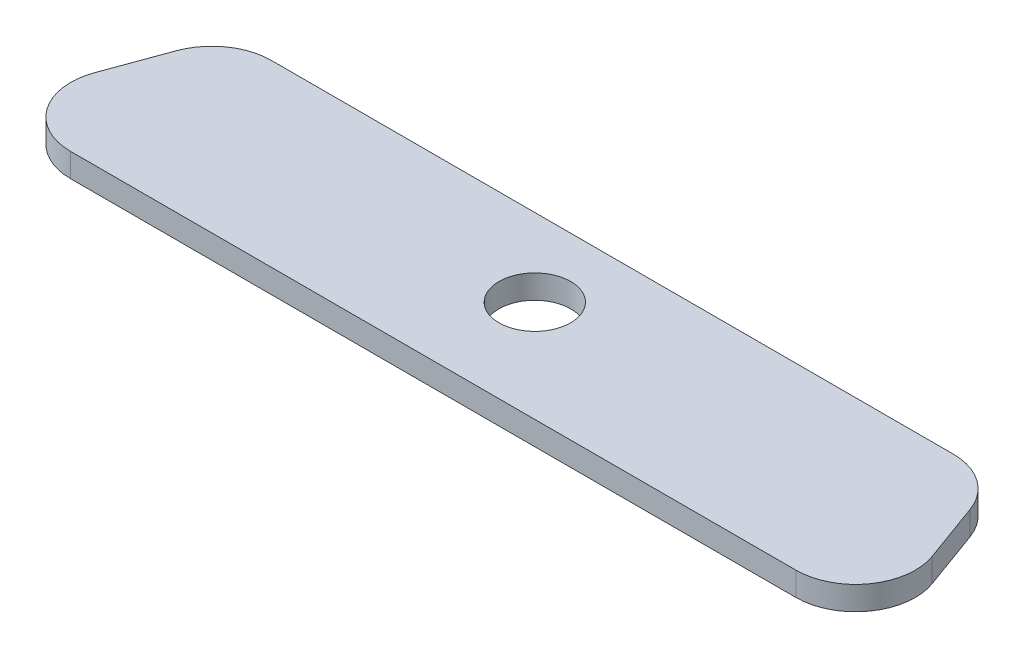
ISO-10303-21;
HEADER;
FILE_DESCRIPTION(('STEP AP214'),'2;1');
FILE_NAME('part.step','',(''),(''),'','','');
FILE_SCHEMA(('AUTOMOTIVE_DESIGN { 1 0 10303 214 1 1 1 1 }'));
ENDSEC;
DATA;
#1=APPLICATION_CONTEXT('core data for automotive mechanical design processes');
#2=APPLICATION_PROTOCOL_DEFINITION('international standard','automotive_design',2000,#1);
#3=PRODUCT_CONTEXT('',#1,'mechanical');
#4=PRODUCT('Part','Part','',(#3));
#5=PRODUCT_RELATED_PRODUCT_CATEGORY('part','',(#4));
#6=PRODUCT_DEFINITION_FORMATION('','',#4);
#7=PRODUCT_DEFINITION_CONTEXT('part definition',#1,'design');
#8=PRODUCT_DEFINITION('design','',#6,#7);
#9=PRODUCT_DEFINITION_SHAPE('','',#8);
#10=(LENGTH_UNIT() NAMED_UNIT(*) SI_UNIT(.MILLI.,.METRE.));
#11=(NAMED_UNIT(*) PLANE_ANGLE_UNIT() SI_UNIT($,.RADIAN.));
#12=(NAMED_UNIT(*) SI_UNIT($,.STERADIAN.) SOLID_ANGLE_UNIT());
#13=UNCERTAINTY_MEASURE_WITH_UNIT(LENGTH_MEASURE(1.E-05),#10,'distance_accuracy_value','');
#14=(GEOMETRIC_REPRESENTATION_CONTEXT(3) GLOBAL_UNCERTAINTY_ASSIGNED_CONTEXT((#13)) GLOBAL_UNIT_ASSIGNED_CONTEXT((#10,
#11,#12)) REPRESENTATION_CONTEXT('',''));
#15=CARTESIAN_POINT('',(0.,0.,0.));
#16=DIRECTION('',(0.,0.,1.));
#17=DIRECTION('',(1.,0.,0.));
#18=AXIS2_PLACEMENT_3D('',#15,#16,#17);
#19=CARTESIAN_POINT('',(0.,0.79375,0.));
#20=DIRECTION('',(0.,1.,0.));
#21=DIRECTION('',(0.,0.,1.));
#22=AXIS2_PLACEMENT_3D('',#19,#20,#21);
#23=PLANE('',#22);
#24=DIRECTION('',(-1.,0.,0.));
#25=VECTOR('',#24,1.);
#26=CARTESIAN_POINT('',(27.8161785944028,0.79375,-6.00000000000001));
#27=LINE('',#26,#25);
#28=CARTESIAN_POINT('',(26.4157635179833,0.79375,-6.00000000000001));
#29=VERTEX_POINT('',#28);
#30=CARTESIAN_POINT('',(3.58423648201666,0.79375,-6.));
#31=VERTEX_POINT('',#30);
#32=EDGE_CURVE('E149',#29,#31,#27,.T.);
#33=ORIENTED_EDGE('',*,*,#32,.T.);
#34=CARTESIAN_POINT('',(3.58423648201666,0.79375,-4.));
#35=DIRECTION('',(0.,1.,0.));
#36=DIRECTION('',(0.,0.,1.));
#37=AXIS2_PLACEMENT_3D('',#34,#35,#36);
#38=CIRCLE('',#37,2.);
#39=CARTESIAN_POINT('',(1.70485124044484,0.79375,-4.68404028665135));
#40=VERTEX_POINT('',#39);
#41=EDGE_CURVE('E179',#31,#40,#38,.T.);
#42=ORIENTED_EDGE('',*,*,#41,.T.);
#43=DIRECTION('',(-0.342020143325672,0.,0.939692620785907));
#44=VECTOR('',#43,1.);
#45=CARTESIAN_POINT('',(2.18382140559724,0.79375,-6.));
#46=LINE('',#45,#44);
#47=CARTESIAN_POINT('',(0.976910771912427,0.79375,-2.68404028665135));
#48=VERTEX_POINT('',#47);
#49=EDGE_CURVE('E128',#40,#48,#46,.T.);
#50=ORIENTED_EDGE('',*,*,#49,.T.);
#51=CARTESIAN_POINT('',(2.85629601348424,0.79375,-2.));
#52=DIRECTION('',(0.,1.,0.));
#53=DIRECTION('',(0.,0.,1.));
#54=AXIS2_PLACEMENT_3D('',#51,#52,#53);
#55=CIRCLE('',#54,2.);
#56=CARTESIAN_POINT('',(2.85629601348424,0.79375,0.));
#57=VERTEX_POINT('',#56);
#58=EDGE_CURVE('E176',#48,#57,#55,.T.);
#59=ORIENTED_EDGE('',*,*,#58,.T.);
#60=DIRECTION('',(1.,0.,0.));
#61=VECTOR('',#60,1.);
#62=CARTESIAN_POINT('',(0.,0.79375,0.));
#63=LINE('',#62,#61);
#64=CARTESIAN_POINT('',(27.1437039865158,0.79375,0.));
#65=VERTEX_POINT('',#64);
#66=EDGE_CURVE('E205',#57,#65,#63,.T.);
#67=ORIENTED_EDGE('',*,*,#66,.T.);
#68=CARTESIAN_POINT('',(27.1437039865158,0.79375,-2.00000000000001));
#69=DIRECTION('',(0.,1.,0.));
#70=DIRECTION('',(0.,0.,1.));
#71=AXIS2_PLACEMENT_3D('',#68,#69,#70);
#72=CIRCLE('',#71,2.);
#73=CARTESIAN_POINT('',(29.0230892280876,0.79375,-2.68404028665135));
#74=VERTEX_POINT('',#73);
#75=EDGE_CURVE('E62',#65,#74,#72,.T.);
#76=ORIENTED_EDGE('',*,*,#75,.T.);
#77=DIRECTION('',(-0.342020143325673,0.,-0.939692620785907));
#78=VECTOR('',#77,1.);
#79=CARTESIAN_POINT('',(30.,0.79375,0.));
#80=LINE('',#79,#78);
#81=CARTESIAN_POINT('',(28.2951487595552,0.79375,-4.68404028665135));
#82=VERTEX_POINT('',#81);
#83=EDGE_CURVE('E193',#74,#82,#80,.T.);
#84=ORIENTED_EDGE('',*,*,#83,.T.);
#85=CARTESIAN_POINT('',(26.4157635179833,0.79375,-4.00000000000001));
#86=DIRECTION('',(0.,1.,0.));
#87=DIRECTION('',(0.,0.,1.));
#88=AXIS2_PLACEMENT_3D('',#85,#86,#87);
#89=CIRCLE('',#88,2.);
#90=EDGE_CURVE('E173',#82,#29,#89,.T.);
#91=ORIENTED_EDGE('',*,*,#90,.T.);
#92=EDGE_LOOP('',(#33,#42,#50,#59,#67,#76,#84,#91));
#93=FACE_BOUND('',#92,.T.);
#94=CARTESIAN_POINT('',(15.,0.79375,-3.40000000000001));
#95=DIRECTION('',(0.,1.,0.));
#96=DIRECTION('',(0.,0.,1.));
#97=AXIS2_PLACEMENT_3D('',#94,#95,#96);
#98=CIRCLE('',#97,1.2);
#99=CARTESIAN_POINT('',(15.,0.79375,-2.2));
#100=VERTEX_POINT('',#99);
#101=EDGE_CURVE('E138',#100,#100,#98,.T.);
#102=ORIENTED_EDGE('',*,*,#101,.F.);
#103=EDGE_LOOP('',(#102));
#104=FACE_BOUND('',#103,.T.);
#105=ADVANCED_FACE('F41',(#93,#104),#23,.T.);
#106=CARTESIAN_POINT('',(0.,0.,0.));
#107=DIRECTION('',(0.,1.,0.));
#108=DIRECTION('',(0.,0.,1.));
#109=AXIS2_PLACEMENT_3D('',#106,#107,#108);
#110=PLANE('',#109);
#111=DIRECTION('',(-0.342020143325672,0.,0.939692620785907));
#112=VECTOR('',#111,1.);
#113=CARTESIAN_POINT('',(2.18382140559724,0.,-6.));
#114=LINE('',#113,#112);
#115=CARTESIAN_POINT('',(1.70485124044484,0.,-4.68404028665135));
#116=VERTEX_POINT('',#115);
#117=CARTESIAN_POINT('',(0.976910771912427,0.,-2.68404028665135));
#118=VERTEX_POINT('',#117);
#119=EDGE_CURVE('E125',#116,#118,#114,.T.);
#120=ORIENTED_EDGE('',*,*,#119,.F.);
#121=CARTESIAN_POINT('',(3.58423648201666,0.,-4.));
#122=DIRECTION('',(0.,1.,0.));
#123=DIRECTION('',(0.,0.,1.));
#124=AXIS2_PLACEMENT_3D('',#121,#122,#123);
#125=CIRCLE('',#124,2.);
#126=CARTESIAN_POINT('',(3.58423648201666,0.,-6.));
#127=VERTEX_POINT('',#126);
#128=EDGE_CURVE('E107',#116,#127,#125,.F.);
#129=ORIENTED_EDGE('',*,*,#128,.T.);
#130=DIRECTION('',(-1.,0.,0.));
#131=VECTOR('',#130,1.);
#132=CARTESIAN_POINT('',(27.8161785944028,0.,-6.00000000000001));
#133=LINE('',#132,#131);
#134=CARTESIAN_POINT('',(26.4157635179833,0.,-6.00000000000001));
#135=VERTEX_POINT('',#134);
#136=EDGE_CURVE('E154',#135,#127,#133,.T.);
#137=ORIENTED_EDGE('',*,*,#136,.F.);
#138=CARTESIAN_POINT('',(26.4157635179833,0.,-4.00000000000001));
#139=DIRECTION('',(0.,1.,0.));
#140=DIRECTION('',(0.,0.,1.));
#141=AXIS2_PLACEMENT_3D('',#138,#139,#140);
#142=CIRCLE('',#141,2.);
#143=CARTESIAN_POINT('',(28.2951487595552,0.,-4.68404028665135));
#144=VERTEX_POINT('',#143);
#145=EDGE_CURVE('E161',#135,#144,#142,.F.);
#146=ORIENTED_EDGE('',*,*,#145,.T.);
#147=DIRECTION('',(-0.342020143325673,0.,-0.939692620785907));
#148=VECTOR('',#147,1.);
#149=CARTESIAN_POINT('',(30.,0.,0.));
#150=LINE('',#149,#148);
#151=CARTESIAN_POINT('',(29.0230892280876,0.,-2.68404028665135));
#152=VERTEX_POINT('',#151);
#153=EDGE_CURVE('E143',#152,#144,#150,.T.);
#154=ORIENTED_EDGE('',*,*,#153,.F.);
#155=CARTESIAN_POINT('',(27.1437039865158,0.,-2.00000000000001));
#156=DIRECTION('',(0.,1.,0.));
#157=DIRECTION('',(0.,0.,1.));
#158=AXIS2_PLACEMENT_3D('',#155,#156,#157);
#159=CIRCLE('',#158,2.);
#160=CARTESIAN_POINT('',(27.1437039865158,0.,0.));
#161=VERTEX_POINT('',#160);
#162=EDGE_CURVE('E130',#152,#161,#159,.F.);
#163=ORIENTED_EDGE('',*,*,#162,.T.);
#164=DIRECTION('',(1.,0.,0.));
#165=VECTOR('',#164,1.);
#166=CARTESIAN_POINT('',(0.,0.,0.));
#167=LINE('',#166,#165);
#168=CARTESIAN_POINT('',(2.85629601348424,0.,0.));
#169=VERTEX_POINT('',#168);
#170=EDGE_CURVE('E137',#169,#161,#167,.T.);
#171=ORIENTED_EDGE('',*,*,#170,.F.);
#172=CARTESIAN_POINT('',(2.85629601348424,0.,-2.));
#173=DIRECTION('',(0.,1.,0.));
#174=DIRECTION('',(0.,0.,1.));
#175=AXIS2_PLACEMENT_3D('',#172,#173,#174);
#176=CIRCLE('',#175,2.);
#177=EDGE_CURVE('E119',#169,#118,#176,.F.);
#178=ORIENTED_EDGE('',*,*,#177,.T.);
#179=EDGE_LOOP('',(#120,#129,#137,#146,#154,#163,#171,#178));
#180=FACE_BOUND('',#179,.T.);
#181=CARTESIAN_POINT('',(15.,0.,-3.40000000000001));
#182=DIRECTION('',(0.,1.,0.));
#183=DIRECTION('',(0.,0.,1.));
#184=AXIS2_PLACEMENT_3D('',#181,#182,#183);
#185=CIRCLE('',#184,1.2);
#186=CARTESIAN_POINT('',(15.,0.,-2.2));
#187=VERTEX_POINT('',#186);
#188=EDGE_CURVE('E146',#187,#187,#185,.T.);
#189=ORIENTED_EDGE('',*,*,#188,.T.);
#190=EDGE_LOOP('',(#189));
#191=FACE_BOUND('',#190,.T.);
#192=ADVANCED_FACE('F133',(#180,#191),#110,.F.);
#193=CARTESIAN_POINT('',(2.18382140559724,0.79375,-6.));
#194=DIRECTION('',(0.939692620785907,0.,0.342020143325672));
#195=DIRECTION('',(0.342020143325672,0.,-0.939692620785907));
#196=AXIS2_PLACEMENT_3D('',#193,#194,#195);
#197=PLANE('',#196);
#198=ORIENTED_EDGE('',*,*,#49,.F.);
#199=DIRECTION('',(0.,-1.,0.));
#200=VECTOR('',#199,1.);
#201=CARTESIAN_POINT('',(1.70485124044484,0.79375,-4.68404028665135));
#202=LINE('',#201,#200);
#203=EDGE_CURVE('E111',#40,#116,#202,.T.);
#204=ORIENTED_EDGE('',*,*,#203,.T.);
#205=ORIENTED_EDGE('',*,*,#119,.T.);
#206=DIRECTION('',(0.,-1.,0.));
#207=VECTOR('',#206,1.);
#208=CARTESIAN_POINT('',(0.976910771912427,0.79375,-2.68404028665135));
#209=LINE('',#208,#207);
#210=EDGE_CURVE('E131',#118,#48,#209,.F.);
#211=ORIENTED_EDGE('',*,*,#210,.T.);
#212=EDGE_LOOP('',(#198,#204,#205,#211));
#213=FACE_BOUND('',#212,.T.);
#214=ADVANCED_FACE('F124',(#213),#197,.F.);
#215=CARTESIAN_POINT('',(0.,0.79375,0.));
#216=DIRECTION('',(0.,0.,-1.));
#217=DIRECTION('',(-1.,0.,0.));
#218=AXIS2_PLACEMENT_3D('',#215,#216,#217);
#219=PLANE('',#218);
#220=ORIENTED_EDGE('',*,*,#66,.F.);
#221=DIRECTION('',(0.,-1.,0.));
#222=VECTOR('',#221,1.);
#223=CARTESIAN_POINT('',(2.85629601348424,0.79375,0.));
#224=LINE('',#223,#222);
#225=EDGE_CURVE('E185',#57,#169,#224,.T.);
#226=ORIENTED_EDGE('',*,*,#225,.T.);
#227=ORIENTED_EDGE('',*,*,#170,.T.);
#228=DIRECTION('',(0.,-1.,0.));
#229=VECTOR('',#228,1.);
#230=CARTESIAN_POINT('',(27.1437039865158,0.79375,0.));
#231=LINE('',#230,#229);
#232=EDGE_CURVE('E182',#161,#65,#231,.F.);
#233=ORIENTED_EDGE('',*,*,#232,.T.);
#234=EDGE_LOOP('',(#220,#226,#227,#233));
#235=FACE_BOUND('',#234,.T.);
#236=ADVANCED_FACE('F236',(#235),#219,.F.);
#237=CARTESIAN_POINT('',(30.,0.79375,0.));
#238=DIRECTION('',(-0.939692620785907,0.,0.342020143325673));
#239=DIRECTION('',(0.342020143325673,0.,0.939692620785907));
#240=AXIS2_PLACEMENT_3D('',#237,#238,#239);
#241=PLANE('',#240);
#242=ORIENTED_EDGE('',*,*,#153,.T.);
#243=DIRECTION('',(0.,-1.,0.));
#244=VECTOR('',#243,1.);
#245=CARTESIAN_POINT('',(28.2951487595552,0.79375,-4.68404028665135));
#246=LINE('',#245,#244);
#247=EDGE_CURVE('E11',#144,#82,#246,.F.);
#248=ORIENTED_EDGE('',*,*,#247,.T.);
#249=ORIENTED_EDGE('',*,*,#83,.F.);
#250=DIRECTION('',(0.,-1.,0.));
#251=VECTOR('',#250,1.);
#252=CARTESIAN_POINT('',(29.0230892280876,0.79375,-2.68404028665135));
#253=LINE('',#252,#251);
#254=EDGE_CURVE('E50',#74,#152,#253,.T.);
#255=ORIENTED_EDGE('',*,*,#254,.T.);
#256=EDGE_LOOP('',(#242,#248,#249,#255));
#257=FACE_BOUND('',#256,.T.);
#258=ADVANCED_FACE('F192',(#257),#241,.F.);
#259=CARTESIAN_POINT('',(27.8161785944028,0.79375,-6.00000000000001));
#260=DIRECTION('',(0.,0.,1.));
#261=DIRECTION('',(1.,0.,0.));
#262=AXIS2_PLACEMENT_3D('',#259,#260,#261);
#263=PLANE('',#262);
#264=ORIENTED_EDGE('',*,*,#136,.T.);
#265=DIRECTION('',(0.,-1.,0.));
#266=VECTOR('',#265,1.);
#267=CARTESIAN_POINT('',(3.58423648201666,0.79375,-6.));
#268=LINE('',#267,#266);
#269=EDGE_CURVE('E112',#127,#31,#268,.F.);
#270=ORIENTED_EDGE('',*,*,#269,.T.);
#271=ORIENTED_EDGE('',*,*,#32,.F.);
#272=DIRECTION('',(0.,-1.,0.));
#273=VECTOR('',#272,1.);
#274=CARTESIAN_POINT('',(26.4157635179833,0.79375,-6.00000000000001));
#275=LINE('',#274,#273);
#276=EDGE_CURVE('E118',#29,#135,#275,.T.);
#277=ORIENTED_EDGE('',*,*,#276,.T.);
#278=EDGE_LOOP('',(#264,#270,#271,#277));
#279=FACE_BOUND('',#278,.T.);
#280=ADVANCED_FACE('F201',(#279),#263,.F.);
#281=CARTESIAN_POINT('',(15.,0.79375,-3.40000000000001));
#282=DIRECTION('',(0.,-1.,0.));
#283=DIRECTION('',(0.,0.,-1.));
#284=AXIS2_PLACEMENT_3D('',#281,#282,#283);
#285=CYLINDRICAL_SURFACE('',#284,1.2);
#286=ORIENTED_EDGE('',*,*,#101,.T.);
#287=EDGE_LOOP('',(#286));
#288=FACE_BOUND('',#287,.T.);
#289=ORIENTED_EDGE('',*,*,#188,.F.);
#290=EDGE_LOOP('',(#289));
#291=FACE_BOUND('',#290,.T.);
#292=ADVANCED_FACE('F215',(#288,#291),#285,.F.);
#293=CARTESIAN_POINT('',(3.58423648201666,0.79375,-4.));
#294=DIRECTION('',(0.,-1.,0.));
#295=DIRECTION('',(0.,0.,-1.));
#296=AXIS2_PLACEMENT_3D('',#293,#294,#295);
#297=CYLINDRICAL_SURFACE('',#296,2.);
#298=ORIENTED_EDGE('',*,*,#41,.F.);
#299=ORIENTED_EDGE('',*,*,#269,.F.);
#300=ORIENTED_EDGE('',*,*,#128,.F.);
#301=ORIENTED_EDGE('',*,*,#203,.F.);
#302=EDGE_LOOP('',(#298,#299,#300,#301));
#303=FACE_BOUND('',#302,.T.);
#304=ADVANCED_FACE('F110',(#303),#297,.T.);
#305=CARTESIAN_POINT('',(2.85629601348424,0.79375,-2.));
#306=DIRECTION('',(0.,-1.,0.));
#307=DIRECTION('',(0.,0.,-1.));
#308=AXIS2_PLACEMENT_3D('',#305,#306,#307);
#309=CYLINDRICAL_SURFACE('',#308,2.);
#310=ORIENTED_EDGE('',*,*,#58,.F.);
#311=ORIENTED_EDGE('',*,*,#210,.F.);
#312=ORIENTED_EDGE('',*,*,#177,.F.);
#313=ORIENTED_EDGE('',*,*,#225,.F.);
#314=EDGE_LOOP('',(#310,#311,#312,#313));
#315=FACE_BOUND('',#314,.T.);
#316=ADVANCED_FACE('F223',(#315),#309,.T.);
#317=CARTESIAN_POINT('',(26.4157635179833,0.79375,-4.00000000000001));
#318=DIRECTION('',(0.,-1.,0.));
#319=DIRECTION('',(0.,0.,-1.));
#320=AXIS2_PLACEMENT_3D('',#317,#318,#319);
#321=CYLINDRICAL_SURFACE('',#320,2.);
#322=ORIENTED_EDGE('',*,*,#90,.F.);
#323=ORIENTED_EDGE('',*,*,#247,.F.);
#324=ORIENTED_EDGE('',*,*,#145,.F.);
#325=ORIENTED_EDGE('',*,*,#276,.F.);
#326=EDGE_LOOP('',(#322,#323,#324,#325));
#327=FACE_BOUND('',#326,.T.);
#328=ADVANCED_FACE('F198',(#327),#321,.T.);
#329=CARTESIAN_POINT('',(27.1437039865158,0.79375,-2.00000000000001));
#330=DIRECTION('',(0.,-1.,0.));
#331=DIRECTION('',(0.,0.,-1.));
#332=AXIS2_PLACEMENT_3D('',#329,#330,#331);
#333=CYLINDRICAL_SURFACE('',#332,2.);
#334=ORIENTED_EDGE('',*,*,#75,.F.);
#335=ORIENTED_EDGE('',*,*,#232,.F.);
#336=ORIENTED_EDGE('',*,*,#162,.F.);
#337=ORIENTED_EDGE('',*,*,#254,.F.);
#338=EDGE_LOOP('',(#334,#335,#336,#337));
#339=FACE_BOUND('',#338,.T.);
#340=ADVANCED_FACE('F43',(#339),#333,.T.);
#341=CLOSED_SHELL('',(#105,#192,#214,#236,#258,#280,#292,#304,#316,#328,#340));
#342=MANIFOLD_SOLID_BREP('B2',#341);
#343=ADVANCED_BREP_SHAPE_REPRESENTATION('',(#18,#342),#14);
#344=SHAPE_DEFINITION_REPRESENTATION(#9,#343);
ENDSEC;
END-ISO-10303-21;
